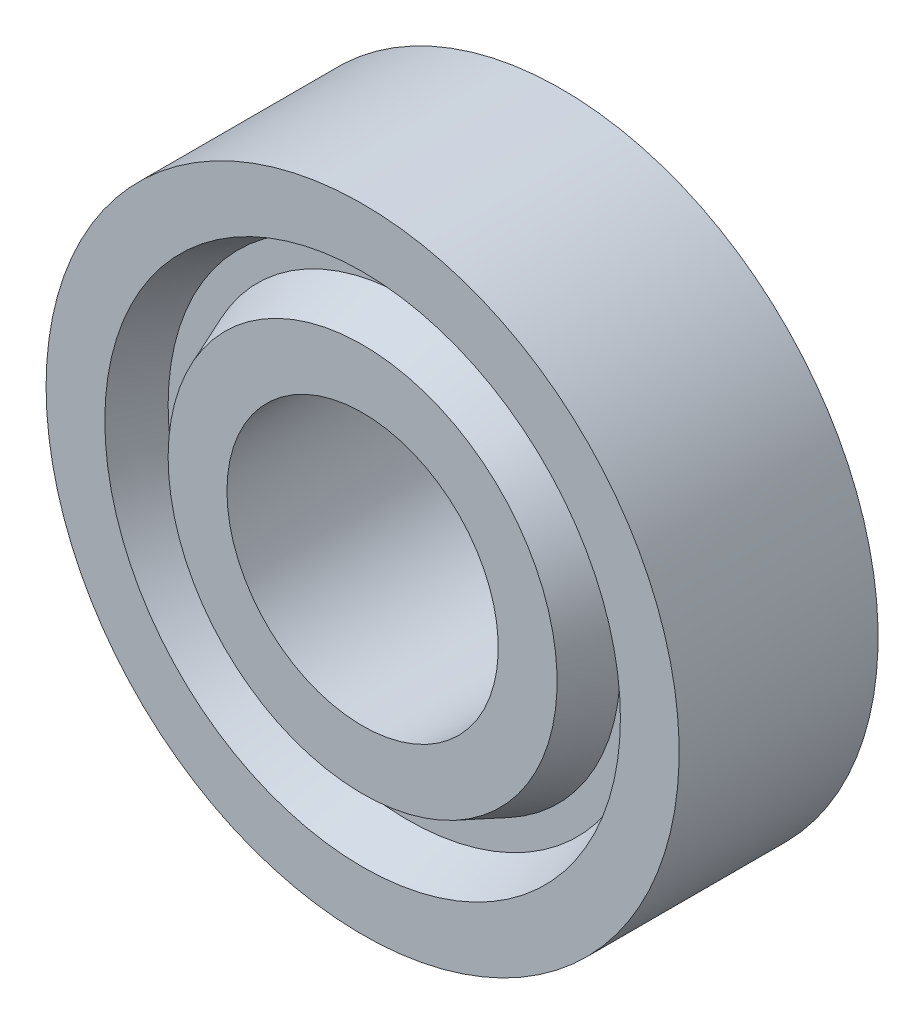
ISO-10303-21;
HEADER;
FILE_DESCRIPTION(('STEP AP214'),'2;1');
FILE_NAME('part.step','',(''),(''),'','','');
FILE_SCHEMA(('AUTOMOTIVE_DESIGN { 1 0 10303 214 1 1 1 1 }'));
ENDSEC;
DATA;
#1=APPLICATION_CONTEXT('core data for automotive mechanical design processes');
#2=APPLICATION_PROTOCOL_DEFINITION('international standard','automotive_design',2000,#1);
#3=PRODUCT_CONTEXT('',#1,'mechanical');
#4=PRODUCT('Part','Part','',(#3));
#5=PRODUCT_RELATED_PRODUCT_CATEGORY('part','',(#4));
#6=PRODUCT_DEFINITION_FORMATION('','',#4);
#7=PRODUCT_DEFINITION_CONTEXT('part definition',#1,'design');
#8=PRODUCT_DEFINITION('design','',#6,#7);
#9=PRODUCT_DEFINITION_SHAPE('','',#8);
#10=(LENGTH_UNIT() NAMED_UNIT(*) SI_UNIT(.MILLI.,.METRE.));
#11=(NAMED_UNIT(*) PLANE_ANGLE_UNIT() SI_UNIT($,.RADIAN.));
#12=(NAMED_UNIT(*) SI_UNIT($,.STERADIAN.) SOLID_ANGLE_UNIT());
#13=UNCERTAINTY_MEASURE_WITH_UNIT(LENGTH_MEASURE(1.E-05),#10,'distance_accuracy_value','');
#14=(GEOMETRIC_REPRESENTATION_CONTEXT(3) GLOBAL_UNCERTAINTY_ASSIGNED_CONTEXT((#13)) GLOBAL_UNIT_ASSIGNED_CONTEXT((#10,
#11,#12)) REPRESENTATION_CONTEXT('',''));
#15=CARTESIAN_POINT('',(0.,0.,0.));
#16=DIRECTION('',(0.,0.,1.));
#17=DIRECTION('',(1.,0.,0.));
#18=AXIS2_PLACEMENT_3D('',#15,#16,#17);
#19=CARTESIAN_POINT('',(7.5,0.,-5.5));
#20=DIRECTION('',(0.,0.,1.));
#21=DIRECTION('',(1.,0.,0.));
#22=AXIS2_PLACEMENT_3D('',#19,#20,#21);
#23=PLANE('',#22);
#24=CARTESIAN_POINT('',(0.,0.,-5.5));
#25=DIRECTION('',(0.,0.,-1.));
#26=DIRECTION('',(-1.,0.,0.));
#27=AXIS2_PLACEMENT_3D('',#24,#25,#26);
#28=CIRCLE('',#27,7.5);
#29=CARTESIAN_POINT('',(-7.49999999999999,0.,-5.5));
#30=VERTEX_POINT('',#29);
#31=EDGE_CURVE('E72',#30,#30,#28,.T.);
#32=ORIENTED_EDGE('',*,*,#31,.F.);
#33=EDGE_LOOP('',(#32));
#34=FACE_BOUND('',#33,.T.);
#35=CARTESIAN_POINT('',(0.,0.,-5.5));
#36=DIRECTION('',(0.,0.,-1.));
#37=DIRECTION('',(-1.,0.,0.));
#38=AXIS2_PLACEMENT_3D('',#35,#36,#37);
#39=CIRCLE('',#38,10.753);
#40=CARTESIAN_POINT('',(-10.753,0.,-5.5));
#41=VERTEX_POINT('',#40);
#42=EDGE_CURVE('E10',#41,#41,#39,.T.);
#43=ORIENTED_EDGE('',*,*,#42,.T.);
#44=EDGE_LOOP('',(#43));
#45=FACE_BOUND('',#44,.T.);
#46=ADVANCED_FACE('F32',(#34,#45),#23,.F.);
#47=CARTESIAN_POINT('',(0.,0.,-3.));
#48=DIRECTION('',(0.,0.,1.));
#49=DIRECTION('',(1.,0.,0.));
#50=AXIS2_PLACEMENT_3D('',#47,#48,#49);
#51=CONICAL_SURFACE('',#50,11.753,0.380506377112365);
#52=ORIENTED_EDGE('',*,*,#42,.F.);
#53=EDGE_LOOP('',(#52));
#54=FACE_BOUND('',#53,.T.);
#55=CARTESIAN_POINT('',(0.,0.,-3.));
#56=DIRECTION('',(0.,0.,-1.));
#57=DIRECTION('',(-1.,0.,0.));
#58=AXIS2_PLACEMENT_3D('',#55,#56,#57);
#59=CIRCLE('',#58,11.753);
#60=CARTESIAN_POINT('',(-11.753,0.,-3.));
#61=VERTEX_POINT('',#60);
#62=EDGE_CURVE('E38',#61,#61,#59,.T.);
#63=ORIENTED_EDGE('',*,*,#62,.T.);
#64=EDGE_LOOP('',(#63));
#65=FACE_BOUND('',#64,.T.);
#66=ADVANCED_FACE('F79',(#54,#65),#51,.T.);
#67=CARTESIAN_POINT('',(11.753,0.,-3.));
#68=DIRECTION('',(0.,0.,1.));
#69=DIRECTION('',(1.,0.,0.));
#70=AXIS2_PLACEMENT_3D('',#67,#68,#69);
#71=PLANE('',#70);
#72=ORIENTED_EDGE('',*,*,#62,.F.);
#73=EDGE_LOOP('',(#72));
#74=FACE_BOUND('',#73,.T.);
#75=CARTESIAN_POINT('',(0.,0.,-3.));
#76=DIRECTION('',(0.,0.,-1.));
#77=DIRECTION('',(-1.,0.,0.));
#78=AXIS2_PLACEMENT_3D('',#75,#76,#77);
#79=CIRCLE('',#78,13.253);
#80=CARTESIAN_POINT('',(-13.253,0.,-2.99999999999999));
#81=VERTEX_POINT('',#80);
#82=EDGE_CURVE('E42',#81,#81,#79,.T.);
#83=ORIENTED_EDGE('',*,*,#82,.T.);
#84=EDGE_LOOP('',(#83));
#85=FACE_BOUND('',#84,.T.);
#86=ADVANCED_FACE('F83',(#74,#85),#71,.F.);
#87=CARTESIAN_POINT('',(0.,0.,-5.49999999999999));
#88=DIRECTION('',(0.,0.,-1.));
#89=DIRECTION('',(-1.,0.,0.));
#90=AXIS2_PLACEMENT_3D('',#87,#88,#89);
#91=CONICAL_SURFACE('',#90,14.253,0.380506377112365);
#92=ORIENTED_EDGE('',*,*,#82,.F.);
#93=EDGE_LOOP('',(#92));
#94=FACE_BOUND('',#93,.T.);
#95=CARTESIAN_POINT('',(0.,0.,-5.49999999999999));
#96=DIRECTION('',(0.,0.,-1.));
#97=DIRECTION('',(-1.,0.,0.));
#98=AXIS2_PLACEMENT_3D('',#95,#96,#97);
#99=CIRCLE('',#98,14.253);
#100=CARTESIAN_POINT('',(-14.253,0.,-5.49999999999999));
#101=VERTEX_POINT('',#100);
#102=EDGE_CURVE('E46',#101,#101,#99,.T.);
#103=ORIENTED_EDGE('',*,*,#102,.T.);
#104=EDGE_LOOP('',(#103));
#105=FACE_BOUND('',#104,.T.);
#106=ADVANCED_FACE('F88',(#94,#105),#91,.F.);
#107=CARTESIAN_POINT('',(14.253,0.,-5.5));
#108=DIRECTION('',(0.,0.,1.));
#109=DIRECTION('',(1.,0.,0.));
#110=AXIS2_PLACEMENT_3D('',#107,#108,#109);
#111=PLANE('',#110);
#112=ORIENTED_EDGE('',*,*,#102,.F.);
#113=EDGE_LOOP('',(#112));
#114=FACE_BOUND('',#113,.T.);
#115=CARTESIAN_POINT('',(0.,0.,-5.49999999999999));
#116=DIRECTION('',(0.,0.,-1.));
#117=DIRECTION('',(-1.,0.,0.));
#118=AXIS2_PLACEMENT_3D('',#115,#116,#117);
#119=CIRCLE('',#118,17.5);
#120=CARTESIAN_POINT('',(-17.5,0.,-5.49999999999999));
#121=VERTEX_POINT('',#120);
#122=EDGE_CURVE('E51',#121,#121,#119,.T.);
#123=ORIENTED_EDGE('',*,*,#122,.T.);
#124=EDGE_LOOP('',(#123));
#125=FACE_BOUND('',#124,.T.);
#126=ADVANCED_FACE('F94',(#114,#125),#111,.F.);
#127=CARTESIAN_POINT('',(0.,0.,-28.9111066531376));
#128=DIRECTION('',(0.,0.,-1.));
#129=DIRECTION('',(-1.,0.,0.));
#130=AXIS2_PLACEMENT_3D('',#127,#128,#129);
#131=CYLINDRICAL_SURFACE('',#130,17.5);
#132=ORIENTED_EDGE('',*,*,#122,.F.);
#133=EDGE_LOOP('',(#132));
#134=FACE_BOUND('',#133,.T.);
#135=CARTESIAN_POINT('',(0.,0.,5.5));
#136=DIRECTION('',(0.,0.,-1.));
#137=DIRECTION('',(-1.,0.,0.));
#138=AXIS2_PLACEMENT_3D('',#135,#136,#137);
#139=CIRCLE('',#138,17.5);
#140=CARTESIAN_POINT('',(-17.5,0.,5.5));
#141=VERTEX_POINT('',#140);
#142=EDGE_CURVE('E54',#141,#141,#139,.T.);
#143=ORIENTED_EDGE('',*,*,#142,.T.);
#144=EDGE_LOOP('',(#143));
#145=FACE_BOUND('',#144,.T.);
#146=ADVANCED_FACE('F98',(#134,#145),#131,.T.);
#147=CARTESIAN_POINT('',(14.253,0.,5.5));
#148=DIRECTION('',(0.,0.,-1.));
#149=DIRECTION('',(-1.,0.,0.));
#150=AXIS2_PLACEMENT_3D('',#147,#148,#149);
#151=PLANE('',#150);
#152=ORIENTED_EDGE('',*,*,#142,.F.);
#153=EDGE_LOOP('',(#152));
#154=FACE_BOUND('',#153,.T.);
#155=CARTESIAN_POINT('',(0.,0.,5.5));
#156=DIRECTION('',(0.,0.,-1.));
#157=DIRECTION('',(-1.,0.,0.));
#158=AXIS2_PLACEMENT_3D('',#155,#156,#157);
#159=CIRCLE('',#158,14.253);
#160=CARTESIAN_POINT('',(-14.253,0.,5.5));
#161=VERTEX_POINT('',#160);
#162=EDGE_CURVE('E57',#161,#161,#159,.T.);
#163=ORIENTED_EDGE('',*,*,#162,.T.);
#164=EDGE_LOOP('',(#163));
#165=FACE_BOUND('',#164,.T.);
#166=ADVANCED_FACE('F102',(#154,#165),#151,.F.);
#167=CARTESIAN_POINT('',(0.,0.,3.));
#168=DIRECTION('',(0.,0.,1.));
#169=DIRECTION('',(1.,0.,0.));
#170=AXIS2_PLACEMENT_3D('',#167,#168,#169);
#171=CONICAL_SURFACE('',#170,13.253,0.380506377112365);
#172=ORIENTED_EDGE('',*,*,#162,.F.);
#173=EDGE_LOOP('',(#172));
#174=FACE_BOUND('',#173,.T.);
#175=CARTESIAN_POINT('',(0.,0.,3.));
#176=DIRECTION('',(0.,0.,-1.));
#177=DIRECTION('',(-1.,0.,0.));
#178=AXIS2_PLACEMENT_3D('',#175,#176,#177);
#179=CIRCLE('',#178,13.253);
#180=CARTESIAN_POINT('',(-13.253,0.,3.));
#181=VERTEX_POINT('',#180);
#182=EDGE_CURVE('E60',#181,#181,#179,.T.);
#183=ORIENTED_EDGE('',*,*,#182,.T.);
#184=EDGE_LOOP('',(#183));
#185=FACE_BOUND('',#184,.T.);
#186=ADVANCED_FACE('F106',(#174,#185),#171,.F.);
#187=CARTESIAN_POINT('',(13.253,0.,3.));
#188=DIRECTION('',(0.,0.,-1.));
#189=DIRECTION('',(-1.,0.,0.));
#190=AXIS2_PLACEMENT_3D('',#187,#188,#189);
#191=PLANE('',#190);
#192=ORIENTED_EDGE('',*,*,#182,.F.);
#193=EDGE_LOOP('',(#192));
#194=FACE_BOUND('',#193,.T.);
#195=CARTESIAN_POINT('',(0.,0.,3.));
#196=DIRECTION('',(0.,0.,-1.));
#197=DIRECTION('',(-1.,0.,0.));
#198=AXIS2_PLACEMENT_3D('',#195,#196,#197);
#199=CIRCLE('',#198,11.753);
#200=CARTESIAN_POINT('',(-11.753,0.,3.));
#201=VERTEX_POINT('',#200);
#202=EDGE_CURVE('E63',#201,#201,#199,.T.);
#203=ORIENTED_EDGE('',*,*,#202,.T.);
#204=EDGE_LOOP('',(#203));
#205=FACE_BOUND('',#204,.T.);
#206=ADVANCED_FACE('F110',(#194,#205),#191,.F.);
#207=CARTESIAN_POINT('',(0.,0.,5.5));
#208=DIRECTION('',(0.,0.,-1.));
#209=DIRECTION('',(-1.,0.,0.));
#210=AXIS2_PLACEMENT_3D('',#207,#208,#209);
#211=CONICAL_SURFACE('',#210,10.753,0.380506377112366);
#212=ORIENTED_EDGE('',*,*,#202,.F.);
#213=EDGE_LOOP('',(#212));
#214=FACE_BOUND('',#213,.T.);
#215=CARTESIAN_POINT('',(0.,0.,5.5));
#216=DIRECTION('',(0.,0.,-1.));
#217=DIRECTION('',(-1.,0.,0.));
#218=AXIS2_PLACEMENT_3D('',#215,#216,#217);
#219=CIRCLE('',#218,10.753);
#220=CARTESIAN_POINT('',(-10.753,0.,5.5));
#221=VERTEX_POINT('',#220);
#222=EDGE_CURVE('E66',#221,#221,#219,.T.);
#223=ORIENTED_EDGE('',*,*,#222,.T.);
#224=EDGE_LOOP('',(#223));
#225=FACE_BOUND('',#224,.T.);
#226=ADVANCED_FACE('F114',(#214,#225),#211,.T.);
#227=CARTESIAN_POINT('',(7.5,0.,5.5));
#228=DIRECTION('',(0.,0.,-1.));
#229=DIRECTION('',(-1.,0.,0.));
#230=AXIS2_PLACEMENT_3D('',#227,#228,#229);
#231=PLANE('',#230);
#232=ORIENTED_EDGE('',*,*,#222,.F.);
#233=EDGE_LOOP('',(#232));
#234=FACE_BOUND('',#233,.T.);
#235=CARTESIAN_POINT('',(0.,0.,5.5));
#236=DIRECTION('',(0.,0.,-1.));
#237=DIRECTION('',(-1.,0.,0.));
#238=AXIS2_PLACEMENT_3D('',#235,#236,#237);
#239=CIRCLE('',#238,7.49999999999999);
#240=CARTESIAN_POINT('',(-7.49999999999999,0.,5.5));
#241=VERTEX_POINT('',#240);
#242=EDGE_CURVE('E69',#241,#241,#239,.T.);
#243=ORIENTED_EDGE('',*,*,#242,.T.);
#244=EDGE_LOOP('',(#243));
#245=FACE_BOUND('',#244,.T.);
#246=ADVANCED_FACE('F118',(#234,#245),#231,.F.);
#247=CARTESIAN_POINT('',(0.,0.,-28.9111066531376));
#248=DIRECTION('',(0.,0.,-1.));
#249=DIRECTION('',(-1.,0.,0.));
#250=AXIS2_PLACEMENT_3D('',#247,#248,#249);
#251=CYLINDRICAL_SURFACE('',#250,7.5);
#252=ORIENTED_EDGE('',*,*,#242,.F.);
#253=EDGE_LOOP('',(#252));
#254=FACE_BOUND('',#253,.T.);
#255=ORIENTED_EDGE('',*,*,#31,.T.);
#256=EDGE_LOOP('',(#255));
#257=FACE_BOUND('',#256,.T.);
#258=ADVANCED_FACE('F76',(#254,#257),#251,.F.);
#259=CLOSED_SHELL('',(#46,#66,#86,#106,#126,#146,#166,#186,#206,#226,#246,#258));
#260=MANIFOLD_SOLID_BREP('B2',#259);
#261=ADVANCED_BREP_SHAPE_REPRESENTATION('',(#18,#260),#14);
#262=SHAPE_DEFINITION_REPRESENTATION(#9,#261);
ENDSEC;
END-ISO-10303-21;
